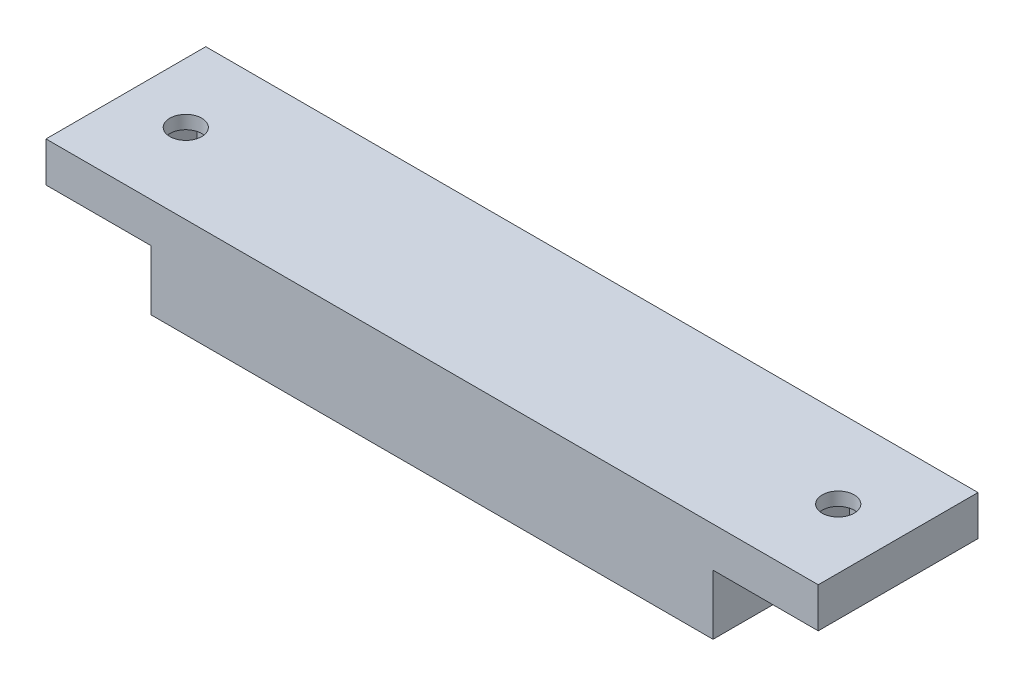
ISO-10303-21;
HEADER;
FILE_DESCRIPTION(('STEP AP214'),'2;1');
FILE_NAME('part.step','',(''),(''),'','','');
FILE_SCHEMA(('AUTOMOTIVE_DESIGN { 1 0 10303 214 1 1 1 1 }'));
ENDSEC;
DATA;
#1=APPLICATION_CONTEXT('core data for automotive mechanical design processes');
#2=APPLICATION_PROTOCOL_DEFINITION('international standard','automotive_design',2000,#1);
#3=PRODUCT_CONTEXT('',#1,'mechanical');
#4=PRODUCT('Part','Part','',(#3));
#5=PRODUCT_RELATED_PRODUCT_CATEGORY('part','',(#4));
#6=PRODUCT_DEFINITION_FORMATION('','',#4);
#7=PRODUCT_DEFINITION_CONTEXT('part definition',#1,'design');
#8=PRODUCT_DEFINITION('design','',#6,#7);
#9=PRODUCT_DEFINITION_SHAPE('','',#8);
#10=(LENGTH_UNIT() NAMED_UNIT(*) SI_UNIT(.MILLI.,.METRE.));
#11=(NAMED_UNIT(*) PLANE_ANGLE_UNIT() SI_UNIT($,.RADIAN.));
#12=(NAMED_UNIT(*) SI_UNIT($,.STERADIAN.) SOLID_ANGLE_UNIT());
#13=UNCERTAINTY_MEASURE_WITH_UNIT(LENGTH_MEASURE(1.E-05),#10,'distance_accuracy_value','');
#14=(GEOMETRIC_REPRESENTATION_CONTEXT(3) GLOBAL_UNCERTAINTY_ASSIGNED_CONTEXT((#13)) GLOBAL_UNIT_ASSIGNED_CONTEXT((#10,
#11,#12)) REPRESENTATION_CONTEXT('',''));
#15=CARTESIAN_POINT('',(0.,0.,0.));
#16=DIRECTION('',(0.,0.,1.));
#17=DIRECTION('',(1.,0.,0.));
#18=AXIS2_PLACEMENT_3D('',#15,#16,#17);
#19=CARTESIAN_POINT('',(21.1,6.,-6.));
#20=DIRECTION('',(-1.,0.,0.));
#21=DIRECTION('',(0.,0.,1.));
#22=AXIS2_PLACEMENT_3D('',#19,#20,#21);
#23=PLANE('',#22);
#24=DIRECTION('',(0.,0.,-1.));
#25=VECTOR('',#24,1.);
#26=CARTESIAN_POINT('',(21.1,4.5,-6.));
#27=LINE('',#26,#25);
#28=CARTESIAN_POINT('',(21.1,4.5,6.));
#29=VERTEX_POINT('',#28);
#30=CARTESIAN_POINT('',(21.1,4.5,-6.));
#31=VERTEX_POINT('',#30);
#32=EDGE_CURVE('E333',#29,#31,#27,.T.);
#33=ORIENTED_EDGE('',*,*,#32,.F.);
#34=DIRECTION('',(0.,-1.,0.));
#35=VECTOR('',#34,1.);
#36=CARTESIAN_POINT('',(21.1,6.,6.));
#37=LINE('',#36,#35);
#38=CARTESIAN_POINT('',(21.1,0.,6.));
#39=VERTEX_POINT('',#38);
#40=EDGE_CURVE('E376',#29,#39,#37,.T.);
#41=ORIENTED_EDGE('',*,*,#40,.T.);
#42=DIRECTION('',(0.,0.,-1.));
#43=VECTOR('',#42,1.);
#44=CARTESIAN_POINT('',(21.1,0.,-6.));
#45=LINE('',#44,#43);
#46=CARTESIAN_POINT('',(21.1,0.,1.24999999999999));
#47=VERTEX_POINT('',#46);
#48=EDGE_CURVE('E363',#39,#47,#45,.T.);
#49=ORIENTED_EDGE('',*,*,#48,.T.);
#50=DIRECTION('',(0.,-0.832050294337844,-0.554700196225229));
#51=VECTOR('',#50,1.);
#52=CARTESIAN_POINT('',(21.1,3.,3.24999999999999));
#53=LINE('',#52,#51);
#54=CARTESIAN_POINT('',(21.1,3.,3.24999999999999));
#55=VERTEX_POINT('',#54);
#56=EDGE_CURVE('E350',#55,#47,#53,.T.);
#57=ORIENTED_EDGE('',*,*,#56,.F.);
#58=DIRECTION('',(0.,0.,1.));
#59=VECTOR('',#58,1.);
#60=CARTESIAN_POINT('',(21.1,3.,3.24999999999999));
#61=LINE('',#60,#59);
#62=CARTESIAN_POINT('',(21.1,2.99999999999999,-3.24999999999998));
#63=VERTEX_POINT('',#62);
#64=EDGE_CURVE('E336',#63,#55,#61,.T.);
#65=ORIENTED_EDGE('',*,*,#64,.F.);
#66=DIRECTION('',(0.,0.832050294337842,-0.554700196225232));
#67=VECTOR('',#66,1.);
#68=CARTESIAN_POINT('',(21.1,2.99999999999999,-3.24999999999998));
#69=LINE('',#68,#67);
#70=CARTESIAN_POINT('',(21.1,0.,-1.24999999999997));
#71=VERTEX_POINT('',#70);
#72=EDGE_CURVE('E341',#71,#63,#69,.T.);
#73=ORIENTED_EDGE('',*,*,#72,.F.);
#74=CARTESIAN_POINT('',(21.1,0.,-6.));
#75=VERTEX_POINT('',#74);
#76=EDGE_CURVE('E356',#71,#75,#45,.T.);
#77=ORIENTED_EDGE('',*,*,#76,.T.);
#78=DIRECTION('',(0.,-1.,0.));
#79=VECTOR('',#78,1.);
#80=CARTESIAN_POINT('',(21.1,6.,-6.));
#81=LINE('',#80,#79);
#82=EDGE_CURVE('E11',#31,#75,#81,.T.);
#83=ORIENTED_EDGE('',*,*,#82,.F.);
#84=EDGE_LOOP('',(#33,#41,#49,#57,#65,#73,#77,#83));
#85=FACE_BOUND('',#84,.T.);
#86=ADVANCED_FACE('F33',(#85),#23,.F.);
#87=CARTESIAN_POINT('',(-21.1,6.,-6.));
#88=DIRECTION('',(1.,0.,0.));
#89=DIRECTION('',(0.,0.,-1.));
#90=AXIS2_PLACEMENT_3D('',#87,#88,#89);
#91=PLANE('',#90);
#92=DIRECTION('',(0.,0.,1.));
#93=VECTOR('',#92,1.);
#94=CARTESIAN_POINT('',(-21.1,4.5,-6.));
#95=LINE('',#94,#93);
#96=CARTESIAN_POINT('',(-21.1,4.5,-6.));
#97=VERTEX_POINT('',#96);
#98=CARTESIAN_POINT('',(-21.1,4.5,6.));
#99=VERTEX_POINT('',#98);
#100=EDGE_CURVE('E325',#97,#99,#95,.T.);
#101=ORIENTED_EDGE('',*,*,#100,.F.);
#102=DIRECTION('',(0.,-1.,0.));
#103=VECTOR('',#102,1.);
#104=CARTESIAN_POINT('',(-21.1,6.,-6.));
#105=LINE('',#104,#103);
#106=CARTESIAN_POINT('',(-21.1,0.,-6.));
#107=VERTEX_POINT('',#106);
#108=EDGE_CURVE('E40',#97,#107,#105,.T.);
#109=ORIENTED_EDGE('',*,*,#108,.T.);
#110=DIRECTION('',(0.,0.,1.));
#111=VECTOR('',#110,1.);
#112=CARTESIAN_POINT('',(-21.1,0.,-6.));
#113=LINE('',#112,#111);
#114=CARTESIAN_POINT('',(-21.1,0.,-1.24999999999999));
#115=VERTEX_POINT('',#114);
#116=EDGE_CURVE('E370',#107,#115,#113,.T.);
#117=ORIENTED_EDGE('',*,*,#116,.T.);
#118=DIRECTION('',(0.,0.832050294337842,-0.554700196225232));
#119=VECTOR('',#118,1.);
#120=CARTESIAN_POINT('',(-21.1,2.99999999999999,-3.25));
#121=LINE('',#120,#119);
#122=CARTESIAN_POINT('',(-21.1,2.99999999999999,-3.25));
#123=VERTEX_POINT('',#122);
#124=EDGE_CURVE('E344',#115,#123,#121,.T.);
#125=ORIENTED_EDGE('',*,*,#124,.T.);
#126=DIRECTION('',(0.,0.,1.));
#127=VECTOR('',#126,1.);
#128=CARTESIAN_POINT('',(-21.1,3.,3.24999999999997));
#129=LINE('',#128,#127);
#130=CARTESIAN_POINT('',(-21.1,3.,3.24999999999997));
#131=VERTEX_POINT('',#130);
#132=EDGE_CURVE('E337',#123,#131,#129,.T.);
#133=ORIENTED_EDGE('',*,*,#132,.T.);
#134=DIRECTION('',(0.,-0.832050294337844,-0.554700196225229));
#135=VECTOR('',#134,1.);
#136=CARTESIAN_POINT('',(-21.1,3.,3.24999999999997));
#137=LINE('',#136,#135);
#138=CARTESIAN_POINT('',(-21.1,0.,1.24999999999997));
#139=VERTEX_POINT('',#138);
#140=EDGE_CURVE('E340',#131,#139,#137,.T.);
#141=ORIENTED_EDGE('',*,*,#140,.T.);
#142=CARTESIAN_POINT('',(-21.1,0.,6.));
#143=VERTEX_POINT('',#142);
#144=EDGE_CURVE('E369',#139,#143,#113,.T.);
#145=ORIENTED_EDGE('',*,*,#144,.T.);
#146=DIRECTION('',(0.,-1.,0.));
#147=VECTOR('',#146,1.);
#148=CARTESIAN_POINT('',(-21.1,6.,6.));
#149=LINE('',#148,#147);
#150=EDGE_CURVE('E378',#99,#143,#149,.T.);
#151=ORIENTED_EDGE('',*,*,#150,.F.);
#152=EDGE_LOOP('',(#101,#109,#117,#125,#133,#141,#145,#151));
#153=FACE_BOUND('',#152,.T.);
#154=ADVANCED_FACE('F381',(#153),#91,.F.);
#155=CARTESIAN_POINT('',(0.,0.,0.));
#156=DIRECTION('',(0.,1.,0.));
#157=DIRECTION('',(0.,0.,1.));
#158=AXIS2_PLACEMENT_3D('',#155,#156,#157);
#159=PLANE('',#158);
#160=ORIENTED_EDGE('',*,*,#76,.F.);
#161=DIRECTION('',(1.,0.,0.));
#162=VECTOR('',#161,1.);
#163=CARTESIAN_POINT('',(-21.1,0.,-1.24999999999999));
#164=LINE('',#163,#162);
#165=EDGE_CURVE('E357',#115,#71,#164,.T.);
#166=ORIENTED_EDGE('',*,*,#165,.F.);
#167=ORIENTED_EDGE('',*,*,#116,.F.);
#168=DIRECTION('',(-1.,0.,0.));
#169=VECTOR('',#168,1.);
#170=CARTESIAN_POINT('',(-21.1,0.,-6.));
#171=LINE('',#170,#169);
#172=EDGE_CURVE('E366',#75,#107,#171,.T.);
#173=ORIENTED_EDGE('',*,*,#172,.F.);
#174=EDGE_LOOP('',(#160,#166,#167,#173));
#175=FACE_BOUND('',#174,.T.);
#176=ADVANCED_FACE('F391',(#175),#159,.F.);
#177=CARTESIAN_POINT('',(-21.1,6.,-6.));
#178=DIRECTION('',(0.,0.,1.));
#179=DIRECTION('',(1.,0.,0.));
#180=AXIS2_PLACEMENT_3D('',#177,#178,#179);
#181=PLANE('',#180);
#182=DIRECTION('',(-1.,0.,0.));
#183=VECTOR('',#182,1.);
#184=CARTESIAN_POINT('',(-29.,4.5,-6.));
#185=LINE('',#184,#183);
#186=CARTESIAN_POINT('',(29.,4.5,-6.));
#187=VERTEX_POINT('',#186);
#188=EDGE_CURVE('E302',#187,#31,#185,.T.);
#189=ORIENTED_EDGE('',*,*,#188,.T.);
#190=ORIENTED_EDGE('',*,*,#82,.T.);
#191=ORIENTED_EDGE('',*,*,#172,.T.);
#192=ORIENTED_EDGE('',*,*,#108,.F.);
#193=CARTESIAN_POINT('',(-29.,4.5,-6.));
#194=VERTEX_POINT('',#193);
#195=EDGE_CURVE('E300',#97,#194,#185,.T.);
#196=ORIENTED_EDGE('',*,*,#195,.T.);
#197=DIRECTION('',(0.,1.,0.));
#198=VECTOR('',#197,1.);
#199=CARTESIAN_POINT('',(-29.,4.5,-6.));
#200=LINE('',#199,#198);
#201=CARTESIAN_POINT('',(-29.,7.5,-6.));
#202=VERTEX_POINT('',#201);
#203=EDGE_CURVE('E328',#194,#202,#200,.T.);
#204=ORIENTED_EDGE('',*,*,#203,.T.);
#205=DIRECTION('',(-1.,0.,0.));
#206=VECTOR('',#205,1.);
#207=CARTESIAN_POINT('',(-29.,7.5,-6.));
#208=LINE('',#207,#206);
#209=CARTESIAN_POINT('',(29.,7.5,-6.));
#210=VERTEX_POINT('',#209);
#211=EDGE_CURVE('E315',#210,#202,#208,.T.);
#212=ORIENTED_EDGE('',*,*,#211,.F.);
#213=DIRECTION('',(0.,1.,0.));
#214=VECTOR('',#213,1.);
#215=CARTESIAN_POINT('',(29.,4.5,-6.));
#216=LINE('',#215,#214);
#217=EDGE_CURVE('E312',#187,#210,#216,.T.);
#218=ORIENTED_EDGE('',*,*,#217,.F.);
#219=EDGE_LOOP('',(#189,#190,#191,#192,#196,#204,#212,#218));
#220=FACE_BOUND('',#219,.T.);
#221=ADVANCED_FACE('F386',(#220),#181,.F.);
#222=CARTESIAN_POINT('',(-21.1,6.,6.));
#223=DIRECTION('',(0.,0.,-1.));
#224=DIRECTION('',(-1.,0.,0.));
#225=AXIS2_PLACEMENT_3D('',#222,#223,#224);
#226=PLANE('',#225);
#227=ORIENTED_EDGE('',*,*,#40,.F.);
#228=DIRECTION('',(1.,0.,0.));
#229=VECTOR('',#228,1.);
#230=CARTESIAN_POINT('',(-29.,4.5,6.));
#231=LINE('',#230,#229);
#232=CARTESIAN_POINT('',(29.,4.5,6.));
#233=VERTEX_POINT('',#232);
#234=EDGE_CURVE('E308',#29,#233,#231,.T.);
#235=ORIENTED_EDGE('',*,*,#234,.T.);
#236=DIRECTION('',(0.,1.,0.));
#237=VECTOR('',#236,1.);
#238=CARTESIAN_POINT('',(29.,4.5,6.));
#239=LINE('',#238,#237);
#240=CARTESIAN_POINT('',(29.,7.5,6.));
#241=VERTEX_POINT('',#240);
#242=EDGE_CURVE('E323',#233,#241,#239,.T.);
#243=ORIENTED_EDGE('',*,*,#242,.T.);
#244=DIRECTION('',(1.,0.,0.));
#245=VECTOR('',#244,1.);
#246=CARTESIAN_POINT('',(-29.,7.5,6.));
#247=LINE('',#246,#245);
#248=CARTESIAN_POINT('',(-29.,7.5,6.));
#249=VERTEX_POINT('',#248);
#250=EDGE_CURVE('E301',#249,#241,#247,.T.);
#251=ORIENTED_EDGE('',*,*,#250,.F.);
#252=DIRECTION('',(0.,1.,0.));
#253=VECTOR('',#252,1.);
#254=CARTESIAN_POINT('',(-29.,4.5,6.));
#255=LINE('',#254,#253);
#256=CARTESIAN_POINT('',(-29.,4.5,6.));
#257=VERTEX_POINT('',#256);
#258=EDGE_CURVE('E326',#257,#249,#255,.T.);
#259=ORIENTED_EDGE('',*,*,#258,.F.);
#260=EDGE_CURVE('E309',#257,#99,#231,.T.);
#261=ORIENTED_EDGE('',*,*,#260,.T.);
#262=ORIENTED_EDGE('',*,*,#150,.T.);
#263=DIRECTION('',(1.,0.,0.));
#264=VECTOR('',#263,1.);
#265=CARTESIAN_POINT('',(-21.1,0.,6.));
#266=LINE('',#265,#264);
#267=EDGE_CURVE('E373',#143,#39,#266,.T.);
#268=ORIENTED_EDGE('',*,*,#267,.T.);
#269=EDGE_LOOP('',(#227,#235,#243,#251,#259,#261,#262,#268));
#270=FACE_BOUND('',#269,.T.);
#271=ADVANCED_FACE('F411',(#270),#226,.F.);
#272=ORIENTED_EDGE('',*,*,#144,.F.);
#273=DIRECTION('',(1.,0.,0.));
#274=VECTOR('',#273,1.);
#275=CARTESIAN_POINT('',(-21.1,0.,1.24999999999997));
#276=LINE('',#275,#274);
#277=EDGE_CURVE('E359',#139,#47,#276,.T.);
#278=ORIENTED_EDGE('',*,*,#277,.T.);
#279=ORIENTED_EDGE('',*,*,#48,.F.);
#280=ORIENTED_EDGE('',*,*,#267,.F.);
#281=EDGE_LOOP('',(#272,#278,#279,#280));
#282=FACE_BOUND('',#281,.T.);
#283=ADVANCED_FACE('F407',(#282),#159,.F.);
#284=CARTESIAN_POINT('',(-21.1,3.,3.24999999999997));
#285=DIRECTION('',(0.,1.,0.));
#286=DIRECTION('',(0.,0.,1.));
#287=AXIS2_PLACEMENT_3D('',#284,#285,#286);
#288=PLANE('',#287);
#289=ORIENTED_EDGE('',*,*,#64,.T.);
#290=DIRECTION('',(1.,0.,0.));
#291=VECTOR('',#290,1.);
#292=CARTESIAN_POINT('',(-21.1,3.,3.24999999999997));
#293=LINE('',#292,#291);
#294=EDGE_CURVE('E347',#131,#55,#293,.T.);
#295=ORIENTED_EDGE('',*,*,#294,.F.);
#296=ORIENTED_EDGE('',*,*,#132,.F.);
#297=DIRECTION('',(1.,0.,0.));
#298=VECTOR('',#297,1.);
#299=CARTESIAN_POINT('',(-21.1,2.99999999999999,-3.25));
#300=LINE('',#299,#298);
#301=EDGE_CURVE('E354',#123,#63,#300,.T.);
#302=ORIENTED_EDGE('',*,*,#301,.T.);
#303=EDGE_LOOP('',(#289,#295,#296,#302));
#304=FACE_BOUND('',#303,.T.);
#305=ADVANCED_FACE('F399',(#304),#288,.F.);
#306=CARTESIAN_POINT('',(-21.1,2.99999999999999,-3.25));
#307=DIRECTION('',(0.,-0.554700196225232,-0.832050294337842));
#308=DIRECTION('',(0.,0.832050294337842,-0.554700196225232));
#309=AXIS2_PLACEMENT_3D('',#306,#307,#308);
#310=PLANE('',#309);
#311=ORIENTED_EDGE('',*,*,#72,.T.);
#312=ORIENTED_EDGE('',*,*,#301,.F.);
#313=ORIENTED_EDGE('',*,*,#124,.F.);
#314=ORIENTED_EDGE('',*,*,#165,.T.);
#315=EDGE_LOOP('',(#311,#312,#313,#314));
#316=FACE_BOUND('',#315,.T.);
#317=ADVANCED_FACE('F394',(#316),#310,.F.);
#318=CARTESIAN_POINT('',(-21.1,3.,3.24999999999997));
#319=DIRECTION('',(0.,-0.554700196225229,0.832050294337844));
#320=DIRECTION('',(0.,-0.832050294337843,-0.554700196225229));
#321=AXIS2_PLACEMENT_3D('',#318,#319,#320);
#322=PLANE('',#321);
#323=ORIENTED_EDGE('',*,*,#56,.T.);
#324=ORIENTED_EDGE('',*,*,#277,.F.);
#325=ORIENTED_EDGE('',*,*,#140,.F.);
#326=ORIENTED_EDGE('',*,*,#294,.T.);
#327=EDGE_LOOP('',(#323,#324,#325,#326));
#328=FACE_BOUND('',#327,.T.);
#329=ADVANCED_FACE('F465',(#328),#322,.F.);
#330=CARTESIAN_POINT('',(0.,4.5,0.));
#331=DIRECTION('',(0.,1.,0.));
#332=DIRECTION('',(0.,0.,1.));
#333=AXIS2_PLACEMENT_3D('',#330,#331,#332);
#334=PLANE('',#333);
#335=DIRECTION('',(1.,0.,0.));
#336=VECTOR('',#335,1.);
#337=CARTESIAN_POINT('',(25.6547005383793,4.5,-2.00000000000001));
#338=LINE('',#337,#336);
#339=CARTESIAN_POINT('',(23.3452994616208,4.5,-2.00000000000001));
#340=VERTEX_POINT('',#339);
#341=CARTESIAN_POINT('',(25.6547005383793,4.5,-2.00000000000001));
#342=VERTEX_POINT('',#341);
#343=EDGE_CURVE('E230',#340,#342,#338,.T.);
#344=ORIENTED_EDGE('',*,*,#343,.F.);
#345=DIRECTION('',(0.499999999999999,0.,-0.866025403784439));
#346=VECTOR('',#345,1.);
#347=CARTESIAN_POINT('',(23.3452994616208,4.5,-2.00000000000001));
#348=LINE('',#347,#346);
#349=CARTESIAN_POINT('',(22.1905989232415,4.5,0.));
#350=VERTEX_POINT('',#349);
#351=EDGE_CURVE('E47',#350,#340,#348,.T.);
#352=ORIENTED_EDGE('',*,*,#351,.F.);
#353=DIRECTION('',(-0.500000000000002,0.,-0.866025403784437));
#354=VECTOR('',#353,1.);
#355=CARTESIAN_POINT('',(22.1905989232415,4.5,0.));
#356=LINE('',#355,#354);
#357=CARTESIAN_POINT('',(23.3452994616208,4.5,1.99999999999999));
#358=VERTEX_POINT('',#357);
#359=EDGE_CURVE('E213',#358,#350,#356,.T.);
#360=ORIENTED_EDGE('',*,*,#359,.F.);
#361=DIRECTION('',(-1.,0.,0.));
#362=VECTOR('',#361,1.);
#363=CARTESIAN_POINT('',(23.3452994616208,4.5,1.99999999999999));
#364=LINE('',#363,#362);
#365=CARTESIAN_POINT('',(25.6547005383793,4.5,1.99999999999999));
#366=VERTEX_POINT('',#365);
#367=EDGE_CURVE('E216',#366,#358,#364,.T.);
#368=ORIENTED_EDGE('',*,*,#367,.F.);
#369=DIRECTION('',(-0.499999999999997,0.,0.86602540378444));
#370=VECTOR('',#369,1.);
#371=CARTESIAN_POINT('',(25.6547005383793,4.5,1.99999999999999));
#372=LINE('',#371,#370);
#373=CARTESIAN_POINT('',(26.8094010767585,4.5,0.));
#374=VERTEX_POINT('',#373);
#375=EDGE_CURVE('E236',#374,#366,#372,.T.);
#376=ORIENTED_EDGE('',*,*,#375,.F.);
#377=DIRECTION('',(0.5,0.,0.866025403784439));
#378=VECTOR('',#377,1.);
#379=CARTESIAN_POINT('',(26.8094010767585,4.5,0.));
#380=LINE('',#379,#378);
#381=EDGE_CURVE('E233',#342,#374,#380,.T.);
#382=ORIENTED_EDGE('',*,*,#381,.F.);
#383=EDGE_LOOP('',(#344,#352,#360,#368,#376,#382));
#384=FACE_BOUND('',#383,.T.);
#385=ORIENTED_EDGE('',*,*,#234,.F.);
#386=ORIENTED_EDGE('',*,*,#32,.T.);
#387=ORIENTED_EDGE('',*,*,#188,.F.);
#388=DIRECTION('',(0.,0.,-1.));
#389=VECTOR('',#388,1.);
#390=CARTESIAN_POINT('',(29.,4.5,-6.));
#391=LINE('',#390,#389);
#392=EDGE_CURVE('E297',#233,#187,#391,.T.);
#393=ORIENTED_EDGE('',*,*,#392,.F.);
#394=EDGE_LOOP('',(#385,#386,#387,#393));
#395=FACE_BOUND('',#394,.T.);
#396=ADVANCED_FACE('F430',(#384,#395),#334,.F.);
#397=DIRECTION('',(-0.5,0.,0.866025403784439));
#398=VECTOR('',#397,1.);
#399=CARTESIAN_POINT('',(-22.1905989232415,4.5,0.));
#400=LINE('',#399,#398);
#401=CARTESIAN_POINT('',(-22.1905989232415,4.5,0.));
#402=VERTEX_POINT('',#401);
#403=CARTESIAN_POINT('',(-23.3452994616208,4.5,2.));
#404=VERTEX_POINT('',#403);
#405=EDGE_CURVE('E271',#402,#404,#400,.T.);
#406=ORIENTED_EDGE('',*,*,#405,.F.);
#407=DIRECTION('',(0.5,0.,0.866025403784439));
#408=VECTOR('',#407,1.);
#409=CARTESIAN_POINT('',(-23.3452994616207,4.5,-2.));
#410=LINE('',#409,#408);
#411=CARTESIAN_POINT('',(-23.3452994616207,4.5,-2.));
#412=VERTEX_POINT('',#411);
#413=EDGE_CURVE('E55',#412,#402,#410,.T.);
#414=ORIENTED_EDGE('',*,*,#413,.F.);
#415=DIRECTION('',(1.,0.,0.));
#416=VECTOR('',#415,1.);
#417=CARTESIAN_POINT('',(-25.6547005383793,4.5,-2.));
#418=LINE('',#417,#416);
#419=CARTESIAN_POINT('',(-25.6547005383793,4.5,-2.));
#420=VERTEX_POINT('',#419);
#421=EDGE_CURVE('E254',#420,#412,#418,.T.);
#422=ORIENTED_EDGE('',*,*,#421,.F.);
#423=DIRECTION('',(0.5,0.,-0.866025403784439));
#424=VECTOR('',#423,1.);
#425=CARTESIAN_POINT('',(-26.8094010767585,4.5,0.));
#426=LINE('',#425,#424);
#427=CARTESIAN_POINT('',(-26.8094010767585,4.5,0.));
#428=VERTEX_POINT('',#427);
#429=EDGE_CURVE('E280',#428,#420,#426,.T.);
#430=ORIENTED_EDGE('',*,*,#429,.F.);
#431=DIRECTION('',(-0.5,0.,-0.866025403784439));
#432=VECTOR('',#431,1.);
#433=CARTESIAN_POINT('',(-25.6547005383793,4.5,2.));
#434=LINE('',#433,#432);
#435=CARTESIAN_POINT('',(-25.6547005383793,4.5,2.));
#436=VERTEX_POINT('',#435);
#437=EDGE_CURVE('E277',#436,#428,#434,.T.);
#438=ORIENTED_EDGE('',*,*,#437,.F.);
#439=DIRECTION('',(-1.,0.,0.));
#440=VECTOR('',#439,1.);
#441=CARTESIAN_POINT('',(-23.3452994616208,4.5,2.));
#442=LINE('',#441,#440);
#443=EDGE_CURVE('E274',#404,#436,#442,.T.);
#444=ORIENTED_EDGE('',*,*,#443,.F.);
#445=EDGE_LOOP('',(#406,#414,#422,#430,#438,#444));
#446=FACE_BOUND('',#445,.T.);
#447=ORIENTED_EDGE('',*,*,#195,.F.);
#448=ORIENTED_EDGE('',*,*,#100,.T.);
#449=ORIENTED_EDGE('',*,*,#260,.F.);
#450=DIRECTION('',(0.,0.,1.));
#451=VECTOR('',#450,1.);
#452=CARTESIAN_POINT('',(-29.,4.5,-6.));
#453=LINE('',#452,#451);
#454=EDGE_CURVE('E305',#194,#257,#453,.T.);
#455=ORIENTED_EDGE('',*,*,#454,.F.);
#456=EDGE_LOOP('',(#447,#448,#449,#455));
#457=FACE_BOUND('',#456,.T.);
#458=ADVANCED_FACE('F415',(#446,#457),#334,.F.);
#459=CARTESIAN_POINT('',(29.,4.5,-6.));
#460=DIRECTION('',(1.,0.,0.));
#461=DIRECTION('',(0.,0.,-1.));
#462=AXIS2_PLACEMENT_3D('',#459,#460,#461);
#463=PLANE('',#462);
#464=DIRECTION('',(0.,0.,-1.));
#465=VECTOR('',#464,1.);
#466=CARTESIAN_POINT('',(29.,7.5,-6.));
#467=LINE('',#466,#465);
#468=EDGE_CURVE('E287',#241,#210,#467,.T.);
#469=ORIENTED_EDGE('',*,*,#468,.F.);
#470=ORIENTED_EDGE('',*,*,#242,.F.);
#471=ORIENTED_EDGE('',*,*,#392,.T.);
#472=ORIENTED_EDGE('',*,*,#217,.T.);
#473=EDGE_LOOP('',(#469,#470,#471,#472));
#474=FACE_BOUND('',#473,.T.);
#475=ADVANCED_FACE('F432',(#474),#463,.T.);
#476=CARTESIAN_POINT('',(-29.,4.5,-6.));
#477=DIRECTION('',(-1.,0.,0.));
#478=DIRECTION('',(0.,0.,1.));
#479=AXIS2_PLACEMENT_3D('',#476,#477,#478);
#480=PLANE('',#479);
#481=DIRECTION('',(0.,0.,1.));
#482=VECTOR('',#481,1.);
#483=CARTESIAN_POINT('',(-29.,7.5,-6.));
#484=LINE('',#483,#482);
#485=EDGE_CURVE('E318',#202,#249,#484,.T.);
#486=ORIENTED_EDGE('',*,*,#485,.F.);
#487=ORIENTED_EDGE('',*,*,#203,.F.);
#488=ORIENTED_EDGE('',*,*,#454,.T.);
#489=ORIENTED_EDGE('',*,*,#258,.T.);
#490=EDGE_LOOP('',(#486,#487,#488,#489));
#491=FACE_BOUND('',#490,.T.);
#492=ADVANCED_FACE('F421',(#491),#480,.T.);
#493=CARTESIAN_POINT('',(0.,7.5,0.));
#494=DIRECTION('',(0.,1.,0.));
#495=DIRECTION('',(0.,0.,1.));
#496=AXIS2_PLACEMENT_3D('',#493,#494,#495);
#497=PLANE('',#496);
#498=CARTESIAN_POINT('',(24.5,7.5,0.));
#499=DIRECTION('',(0.,1.,0.));
#500=DIRECTION('',(0.,0.,1.));
#501=AXIS2_PLACEMENT_3D('',#498,#499,#500);
#502=CIRCLE('',#501,1.2);
#503=CARTESIAN_POINT('',(24.5,7.5,1.2));
#504=VERTEX_POINT('',#503);
#505=EDGE_CURVE('E659',#504,#504,#502,.F.);
#506=ORIENTED_EDGE('',*,*,#505,.T.);
#507=EDGE_LOOP('',(#506));
#508=FACE_BOUND('',#507,.T.);
#509=CARTESIAN_POINT('',(-24.5,7.5,0.));
#510=DIRECTION('',(0.,1.,0.));
#511=DIRECTION('',(0.,0.,1.));
#512=AXIS2_PLACEMENT_3D('',#509,#510,#511);
#513=CIRCLE('',#512,1.2);
#514=CARTESIAN_POINT('',(-24.5,7.5,1.2));
#515=VERTEX_POINT('',#514);
#516=EDGE_CURVE('E219',#515,#515,#513,.F.);
#517=ORIENTED_EDGE('',*,*,#516,.T.);
#518=EDGE_LOOP('',(#517));
#519=FACE_BOUND('',#518,.T.);
#520=ORIENTED_EDGE('',*,*,#468,.T.);
#521=ORIENTED_EDGE('',*,*,#211,.T.);
#522=ORIENTED_EDGE('',*,*,#485,.T.);
#523=ORIENTED_EDGE('',*,*,#250,.T.);
#524=EDGE_LOOP('',(#520,#521,#522,#523));
#525=FACE_BOUND('',#524,.T.);
#526=ADVANCED_FACE('F424',(#508,#519,#525),#497,.T.);
#527=CARTESIAN_POINT('',(-23.3452994616207,6.5,-2.));
#528=DIRECTION('',(0.866025403784439,0.,-0.5));
#529=DIRECTION('',(-0.5,0.,-0.866025403784439));
#530=AXIS2_PLACEMENT_3D('',#527,#528,#529);
#531=PLANE('',#530);
#532=ORIENTED_EDGE('',*,*,#413,.T.);
#533=DIRECTION('',(0.,-1.,0.));
#534=VECTOR('',#533,1.);
#535=CARTESIAN_POINT('',(-22.1905989232415,6.5,0.));
#536=LINE('',#535,#534);
#537=CARTESIAN_POINT('',(-22.1905989232415,6.5,0.));
#538=VERTEX_POINT('',#537);
#539=EDGE_CURVE('E269',#538,#402,#536,.T.);
#540=ORIENTED_EDGE('',*,*,#539,.F.);
#541=DIRECTION('',(0.5,0.,0.866025403784439));
#542=VECTOR('',#541,1.);
#543=CARTESIAN_POINT('',(-23.3452994616207,6.5,-2.));
#544=LINE('',#543,#542);
#545=CARTESIAN_POINT('',(-23.3452994616207,6.5,-2.));
#546=VERTEX_POINT('',#545);
#547=EDGE_CURVE('E250',#546,#538,#544,.T.);
#548=ORIENTED_EDGE('',*,*,#547,.F.);
#549=DIRECTION('',(0.,-1.,0.));
#550=VECTOR('',#549,1.);
#551=CARTESIAN_POINT('',(-23.3452994616207,6.5,-2.));
#552=LINE('',#551,#550);
#553=EDGE_CURVE('E285',#546,#412,#552,.T.);
#554=ORIENTED_EDGE('',*,*,#553,.T.);
#555=EDGE_LOOP('',(#532,#540,#548,#554));
#556=FACE_BOUND('',#555,.T.);
#557=ADVANCED_FACE('F493',(#556),#531,.F.);
#558=CARTESIAN_POINT('',(-25.6547005383793,6.5,-2.));
#559=DIRECTION('',(0.,0.,-1.));
#560=DIRECTION('',(-1.,0.,0.));
#561=AXIS2_PLACEMENT_3D('',#558,#559,#560);
#562=PLANE('',#561);
#563=ORIENTED_EDGE('',*,*,#421,.T.);
#564=ORIENTED_EDGE('',*,*,#553,.F.);
#565=DIRECTION('',(1.,0.,0.));
#566=VECTOR('',#565,1.);
#567=CARTESIAN_POINT('',(-25.6547005383793,6.5,-2.));
#568=LINE('',#567,#566);
#569=CARTESIAN_POINT('',(-25.6547005383793,6.5,-2.));
#570=VERTEX_POINT('',#569);
#571=EDGE_CURVE('E266',#570,#546,#568,.T.);
#572=ORIENTED_EDGE('',*,*,#571,.F.);
#573=DIRECTION('',(0.,-1.,0.));
#574=VECTOR('',#573,1.);
#575=CARTESIAN_POINT('',(-25.6547005383793,6.5,-2.));
#576=LINE('',#575,#574);
#577=EDGE_CURVE('E288',#570,#420,#576,.T.);
#578=ORIENTED_EDGE('',*,*,#577,.T.);
#579=EDGE_LOOP('',(#563,#564,#572,#578));
#580=FACE_BOUND('',#579,.T.);
#581=ADVANCED_FACE('F498',(#580),#562,.F.);
#582=CARTESIAN_POINT('',(-26.8094010767585,6.5,0.));
#583=DIRECTION('',(-0.866025403784439,0.,-0.5));
#584=DIRECTION('',(-0.5,0.,0.866025403784439));
#585=AXIS2_PLACEMENT_3D('',#582,#583,#584);
#586=PLANE('',#585);
#587=ORIENTED_EDGE('',*,*,#429,.T.);
#588=ORIENTED_EDGE('',*,*,#577,.F.);
#589=DIRECTION('',(0.5,0.,-0.866025403784439));
#590=VECTOR('',#589,1.);
#591=CARTESIAN_POINT('',(-26.8094010767585,6.5,0.));
#592=LINE('',#591,#590);
#593=CARTESIAN_POINT('',(-26.8094010767585,6.5,0.));
#594=VERTEX_POINT('',#593);
#595=EDGE_CURVE('E263',#594,#570,#592,.T.);
#596=ORIENTED_EDGE('',*,*,#595,.F.);
#597=DIRECTION('',(0.,-1.,0.));
#598=VECTOR('',#597,1.);
#599=CARTESIAN_POINT('',(-26.8094010767585,6.5,0.));
#600=LINE('',#599,#598);
#601=EDGE_CURVE('E290',#594,#428,#600,.T.);
#602=ORIENTED_EDGE('',*,*,#601,.T.);
#603=EDGE_LOOP('',(#587,#588,#596,#602));
#604=FACE_BOUND('',#603,.T.);
#605=ADVANCED_FACE('F509',(#604),#586,.F.);
#606=CARTESIAN_POINT('',(-25.6547005383793,6.5,2.));
#607=DIRECTION('',(-0.866025403784439,0.,0.5));
#608=DIRECTION('',(0.5,0.,0.866025403784439));
#609=AXIS2_PLACEMENT_3D('',#606,#607,#608);
#610=PLANE('',#609);
#611=ORIENTED_EDGE('',*,*,#437,.T.);
#612=ORIENTED_EDGE('',*,*,#601,.F.);
#613=DIRECTION('',(-0.5,0.,-0.866025403784439));
#614=VECTOR('',#613,1.);
#615=CARTESIAN_POINT('',(-25.6547005383793,6.5,2.));
#616=LINE('',#615,#614);
#617=CARTESIAN_POINT('',(-25.6547005383793,6.5,2.));
#618=VERTEX_POINT('',#617);
#619=EDGE_CURVE('E260',#618,#594,#616,.T.);
#620=ORIENTED_EDGE('',*,*,#619,.F.);
#621=DIRECTION('',(0.,-1.,0.));
#622=VECTOR('',#621,1.);
#623=CARTESIAN_POINT('',(-25.6547005383793,6.5,2.));
#624=LINE('',#623,#622);
#625=EDGE_CURVE('E292',#618,#436,#624,.T.);
#626=ORIENTED_EDGE('',*,*,#625,.T.);
#627=EDGE_LOOP('',(#611,#612,#620,#626));
#628=FACE_BOUND('',#627,.T.);
#629=ADVANCED_FACE('F519',(#628),#610,.F.);
#630=CARTESIAN_POINT('',(-23.3452994616208,6.5,2.));
#631=DIRECTION('',(0.,0.,1.));
#632=DIRECTION('',(1.,0.,0.));
#633=AXIS2_PLACEMENT_3D('',#630,#631,#632);
#634=PLANE('',#633);
#635=ORIENTED_EDGE('',*,*,#443,.T.);
#636=ORIENTED_EDGE('',*,*,#625,.F.);
#637=DIRECTION('',(-1.,0.,0.));
#638=VECTOR('',#637,1.);
#639=CARTESIAN_POINT('',(-23.3452994616208,6.5,2.));
#640=LINE('',#639,#638);
#641=CARTESIAN_POINT('',(-23.3452994616208,6.5,2.));
#642=VERTEX_POINT('',#641);
#643=EDGE_CURVE('E257',#642,#618,#640,.T.);
#644=ORIENTED_EDGE('',*,*,#643,.F.);
#645=DIRECTION('',(0.,-1.,0.));
#646=VECTOR('',#645,1.);
#647=CARTESIAN_POINT('',(-23.3452994616208,6.5,2.));
#648=LINE('',#647,#646);
#649=EDGE_CURVE('E294',#642,#404,#648,.T.);
#650=ORIENTED_EDGE('',*,*,#649,.T.);
#651=EDGE_LOOP('',(#635,#636,#644,#650));
#652=FACE_BOUND('',#651,.T.);
#653=ADVANCED_FACE('F529',(#652),#634,.F.);
#654=CARTESIAN_POINT('',(-22.1905989232415,6.5,0.));
#655=DIRECTION('',(0.866025403784439,0.,0.5));
#656=DIRECTION('',(0.5,0.,-0.866025403784439));
#657=AXIS2_PLACEMENT_3D('',#654,#655,#656);
#658=PLANE('',#657);
#659=ORIENTED_EDGE('',*,*,#405,.T.);
#660=ORIENTED_EDGE('',*,*,#649,.F.);
#661=DIRECTION('',(-0.5,0.,0.866025403784439));
#662=VECTOR('',#661,1.);
#663=CARTESIAN_POINT('',(-22.1905989232415,6.5,0.));
#664=LINE('',#663,#662);
#665=EDGE_CURVE('E253',#538,#642,#664,.T.);
#666=ORIENTED_EDGE('',*,*,#665,.F.);
#667=ORIENTED_EDGE('',*,*,#539,.T.);
#668=EDGE_LOOP('',(#659,#660,#666,#667));
#669=FACE_BOUND('',#668,.T.);
#670=ADVANCED_FACE('F539',(#669),#658,.F.);
#671=CARTESIAN_POINT('',(0.,6.5,0.));
#672=DIRECTION('',(0.,-1.,0.));
#673=DIRECTION('',(0.,0.,-1.));
#674=AXIS2_PLACEMENT_3D('',#671,#672,#673);
#675=PLANE('',#674);
#676=CARTESIAN_POINT('',(-24.5,6.5,0.));
#677=DIRECTION('',(0.,-1.,0.));
#678=DIRECTION('',(0.,0.,-1.));
#679=AXIS2_PLACEMENT_3D('',#676,#677,#678);
#680=CIRCLE('',#679,1.2);
#681=CARTESIAN_POINT('',(-24.5,6.5,-1.2));
#682=VERTEX_POINT('',#681);
#683=EDGE_CURVE('E231',#682,#682,#680,.T.);
#684=ORIENTED_EDGE('',*,*,#683,.F.);
#685=EDGE_LOOP('',(#684));
#686=FACE_BOUND('',#685,.T.);
#687=ORIENTED_EDGE('',*,*,#547,.T.);
#688=ORIENTED_EDGE('',*,*,#665,.T.);
#689=ORIENTED_EDGE('',*,*,#643,.T.);
#690=ORIENTED_EDGE('',*,*,#619,.T.);
#691=ORIENTED_EDGE('',*,*,#595,.T.);
#692=ORIENTED_EDGE('',*,*,#571,.T.);
#693=EDGE_LOOP('',(#687,#688,#689,#690,#691,#692));
#694=FACE_BOUND('',#693,.T.);
#695=ADVANCED_FACE('F549',(#686,#694),#675,.T.);
#696=CARTESIAN_POINT('',(23.3452994616208,6.5,-2.00000000000001));
#697=DIRECTION('',(-0.866025403784439,0.,-0.499999999999999));
#698=DIRECTION('',(-0.499999999999999,0.,0.866025403784439));
#699=AXIS2_PLACEMENT_3D('',#696,#697,#698);
#700=PLANE('',#699);
#701=ORIENTED_EDGE('',*,*,#351,.T.);
#702=DIRECTION('',(0.,-1.,0.));
#703=VECTOR('',#702,1.);
#704=CARTESIAN_POINT('',(23.3452994616208,6.5,-2.00000000000001));
#705=LINE('',#704,#703);
#706=CARTESIAN_POINT('',(23.3452994616208,6.5,-2.00000000000001));
#707=VERTEX_POINT('',#706);
#708=EDGE_CURVE('E190',#707,#340,#705,.T.);
#709=ORIENTED_EDGE('',*,*,#708,.F.);
#710=DIRECTION('',(0.499999999999999,0.,-0.866025403784439));
#711=VECTOR('',#710,1.);
#712=CARTESIAN_POINT('',(23.3452994616208,6.5,-2.00000000000001));
#713=LINE('',#712,#711);
#714=CARTESIAN_POINT('',(22.1905989232415,6.5,0.));
#715=VERTEX_POINT('',#714);
#716=EDGE_CURVE('E194',#715,#707,#713,.T.);
#717=ORIENTED_EDGE('',*,*,#716,.F.);
#718=DIRECTION('',(0.,-1.,0.));
#719=VECTOR('',#718,1.);
#720=CARTESIAN_POINT('',(22.1905989232415,6.5,0.));
#721=LINE('',#720,#719);
#722=EDGE_CURVE('E241',#715,#350,#721,.T.);
#723=ORIENTED_EDGE('',*,*,#722,.T.);
#724=EDGE_LOOP('',(#701,#709,#717,#723));
#725=FACE_BOUND('',#724,.T.);
#726=ADVANCED_FACE('F192',(#725),#700,.F.);
#727=CARTESIAN_POINT('',(22.1905989232415,6.5,0.));
#728=DIRECTION('',(-0.866025403784437,0.,0.500000000000002));
#729=DIRECTION('',(0.500000000000002,0.,0.866025403784437));
#730=AXIS2_PLACEMENT_3D('',#727,#728,#729);
#731=PLANE('',#730);
#732=ORIENTED_EDGE('',*,*,#359,.T.);
#733=ORIENTED_EDGE('',*,*,#722,.F.);
#734=DIRECTION('',(-0.500000000000002,0.,-0.866025403784437));
#735=VECTOR('',#734,1.);
#736=CARTESIAN_POINT('',(22.1905989232415,6.5,0.));
#737=LINE('',#736,#735);
#738=CARTESIAN_POINT('',(23.3452994616208,6.5,1.99999999999999));
#739=VERTEX_POINT('',#738);
#740=EDGE_CURVE('E200',#739,#715,#737,.T.);
#741=ORIENTED_EDGE('',*,*,#740,.F.);
#742=DIRECTION('',(0.,-1.,0.));
#743=VECTOR('',#742,1.);
#744=CARTESIAN_POINT('',(23.3452994616208,6.5,1.99999999999999));
#745=LINE('',#744,#743);
#746=EDGE_CURVE('E243',#739,#358,#745,.T.);
#747=ORIENTED_EDGE('',*,*,#746,.T.);
#748=EDGE_LOOP('',(#732,#733,#741,#747));
#749=FACE_BOUND('',#748,.T.);
#750=ADVANCED_FACE('F561',(#749),#731,.F.);
#751=CARTESIAN_POINT('',(23.3452994616208,6.5,1.99999999999999));
#752=DIRECTION('',(0.,0.,1.));
#753=DIRECTION('',(1.,0.,0.));
#754=AXIS2_PLACEMENT_3D('',#751,#752,#753);
#755=PLANE('',#754);
#756=ORIENTED_EDGE('',*,*,#367,.T.);
#757=ORIENTED_EDGE('',*,*,#746,.F.);
#758=DIRECTION('',(-1.,0.,0.));
#759=VECTOR('',#758,1.);
#760=CARTESIAN_POINT('',(23.3452994616208,6.5,1.99999999999999));
#761=LINE('',#760,#759);
#762=CARTESIAN_POINT('',(25.6547005383793,6.5,1.99999999999999));
#763=VERTEX_POINT('',#762);
#764=EDGE_CURVE('E226',#763,#739,#761,.T.);
#765=ORIENTED_EDGE('',*,*,#764,.F.);
#766=DIRECTION('',(0.,-1.,0.));
#767=VECTOR('',#766,1.);
#768=CARTESIAN_POINT('',(25.6547005383793,6.5,1.99999999999999));
#769=LINE('',#768,#767);
#770=EDGE_CURVE('E245',#763,#366,#769,.T.);
#771=ORIENTED_EDGE('',*,*,#770,.T.);
#772=EDGE_LOOP('',(#756,#757,#765,#771));
#773=FACE_BOUND('',#772,.T.);
#774=ADVANCED_FACE('F570',(#773),#755,.F.);
#775=CARTESIAN_POINT('',(25.6547005383793,6.5,1.99999999999999));
#776=DIRECTION('',(0.86602540378444,0.,0.499999999999997));
#777=DIRECTION('',(0.499999999999997,0.,-0.86602540378444));
#778=AXIS2_PLACEMENT_3D('',#775,#776,#777);
#779=PLANE('',#778);
#780=ORIENTED_EDGE('',*,*,#375,.T.);
#781=ORIENTED_EDGE('',*,*,#770,.F.);
#782=DIRECTION('',(-0.499999999999997,0.,0.86602540378444));
#783=VECTOR('',#782,1.);
#784=CARTESIAN_POINT('',(25.6547005383793,6.5,1.99999999999999));
#785=LINE('',#784,#783);
#786=CARTESIAN_POINT('',(26.8094010767585,6.5,0.));
#787=VERTEX_POINT('',#786);
#788=EDGE_CURVE('E223',#787,#763,#785,.T.);
#789=ORIENTED_EDGE('',*,*,#788,.F.);
#790=DIRECTION('',(0.,-1.,0.));
#791=VECTOR('',#790,1.);
#792=CARTESIAN_POINT('',(26.8094010767585,6.5,0.));
#793=LINE('',#792,#791);
#794=EDGE_CURVE('E247',#787,#374,#793,.T.);
#795=ORIENTED_EDGE('',*,*,#794,.T.);
#796=EDGE_LOOP('',(#780,#781,#789,#795));
#797=FACE_BOUND('',#796,.T.);
#798=ADVANCED_FACE('F580',(#797),#779,.F.);
#799=CARTESIAN_POINT('',(26.8094010767585,6.5,0.));
#800=DIRECTION('',(0.866025403784439,0.,-0.5));
#801=DIRECTION('',(-0.5,0.,-0.866025403784439));
#802=AXIS2_PLACEMENT_3D('',#799,#800,#801);
#803=PLANE('',#802);
#804=ORIENTED_EDGE('',*,*,#381,.T.);
#805=ORIENTED_EDGE('',*,*,#794,.F.);
#806=DIRECTION('',(0.5,0.,0.866025403784439));
#807=VECTOR('',#806,1.);
#808=CARTESIAN_POINT('',(26.8094010767585,6.5,0.));
#809=LINE('',#808,#807);
#810=CARTESIAN_POINT('',(25.6547005383793,6.5,-2.00000000000001));
#811=VERTEX_POINT('',#810);
#812=EDGE_CURVE('E208',#811,#787,#809,.T.);
#813=ORIENTED_EDGE('',*,*,#812,.F.);
#814=DIRECTION('',(0.,-1.,0.));
#815=VECTOR('',#814,1.);
#816=CARTESIAN_POINT('',(25.6547005383793,6.5,-2.00000000000001));
#817=LINE('',#816,#815);
#818=EDGE_CURVE('E199',#811,#342,#817,.T.);
#819=ORIENTED_EDGE('',*,*,#818,.T.);
#820=EDGE_LOOP('',(#804,#805,#813,#819));
#821=FACE_BOUND('',#820,.T.);
#822=ADVANCED_FACE('F590',(#821),#803,.F.);
#823=CARTESIAN_POINT('',(25.6547005383793,6.5,-2.00000000000001));
#824=DIRECTION('',(0.,0.,-1.));
#825=DIRECTION('',(-1.,0.,0.));
#826=AXIS2_PLACEMENT_3D('',#823,#824,#825);
#827=PLANE('',#826);
#828=ORIENTED_EDGE('',*,*,#343,.T.);
#829=ORIENTED_EDGE('',*,*,#818,.F.);
#830=DIRECTION('',(1.,0.,0.));
#831=VECTOR('',#830,1.);
#832=CARTESIAN_POINT('',(25.6547005383793,6.5,-2.00000000000001));
#833=LINE('',#832,#831);
#834=EDGE_CURVE('E203',#707,#811,#833,.T.);
#835=ORIENTED_EDGE('',*,*,#834,.F.);
#836=ORIENTED_EDGE('',*,*,#708,.T.);
#837=EDGE_LOOP('',(#828,#829,#835,#836));
#838=FACE_BOUND('',#837,.T.);
#839=ADVANCED_FACE('F204',(#838),#827,.F.);
#840=CARTESIAN_POINT('',(0.,6.5,0.));
#841=DIRECTION('',(0.,1.,0.));
#842=DIRECTION('',(0.,0.,1.));
#843=AXIS2_PLACEMENT_3D('',#840,#841,#842);
#844=PLANE('',#843);
#845=CARTESIAN_POINT('',(24.5,6.5,0.));
#846=DIRECTION('',(0.,-1.,0.));
#847=DIRECTION('',(0.,0.,-1.));
#848=AXIS2_PLACEMENT_3D('',#845,#846,#847);
#849=CIRCLE('',#848,1.2);
#850=CARTESIAN_POINT('',(24.5,6.5,-1.2));
#851=VERTEX_POINT('',#850);
#852=EDGE_CURVE('E662',#851,#851,#849,.T.);
#853=ORIENTED_EDGE('',*,*,#852,.F.);
#854=EDGE_LOOP('',(#853));
#855=FACE_BOUND('',#854,.T.);
#856=ORIENTED_EDGE('',*,*,#716,.T.);
#857=ORIENTED_EDGE('',*,*,#834,.T.);
#858=ORIENTED_EDGE('',*,*,#812,.T.);
#859=ORIENTED_EDGE('',*,*,#788,.T.);
#860=ORIENTED_EDGE('',*,*,#764,.T.);
#861=ORIENTED_EDGE('',*,*,#740,.T.);
#862=EDGE_LOOP('',(#856,#857,#858,#859,#860,#861));
#863=FACE_BOUND('',#862,.T.);
#864=ADVANCED_FACE('F210',(#855,#863),#844,.F.);
#865=CARTESIAN_POINT('',(-24.5,7.501,0.));
#866=DIRECTION('',(0.,-1.,0.));
#867=DIRECTION('',(0.,0.,-1.));
#868=AXIS2_PLACEMENT_3D('',#865,#866,#867);
#869=CYLINDRICAL_SURFACE('',#868,1.2);
#870=ORIENTED_EDGE('',*,*,#516,.F.);
#871=EDGE_LOOP('',(#870));
#872=FACE_BOUND('',#871,.T.);
#873=ORIENTED_EDGE('',*,*,#683,.T.);
#874=EDGE_LOOP('',(#873));
#875=FACE_BOUND('',#874,.T.);
#876=ADVANCED_FACE('F632',(#872,#875),#869,.F.);
#877=CARTESIAN_POINT('',(24.5,7.501,0.));
#878=DIRECTION('',(0.,-1.,0.));
#879=DIRECTION('',(0.,0.,-1.));
#880=AXIS2_PLACEMENT_3D('',#877,#878,#879);
#881=CYLINDRICAL_SURFACE('',#880,1.2);
#882=ORIENTED_EDGE('',*,*,#505,.F.);
#883=EDGE_LOOP('',(#882));
#884=FACE_BOUND('',#883,.T.);
#885=ORIENTED_EDGE('',*,*,#852,.T.);
#886=EDGE_LOOP('',(#885));
#887=FACE_BOUND('',#886,.T.);
#888=ADVANCED_FACE('F642',(#884,#887),#881,.F.);
#889=CLOSED_SHELL('',(#86,#154,#176,#221,#271,#283,#305,#317,#329,#396,#458,#475,#492,#526,#557,
#581,#605,#629,#653,#670,#695,#726,#750,#774,#798,#822,#839,#864,#876,#888));
#890=MANIFOLD_SOLID_BREP('B2',#889);
#891=ADVANCED_BREP_SHAPE_REPRESENTATION('',(#18,#890),#14);
#892=SHAPE_DEFINITION_REPRESENTATION(#9,#891);
ENDSEC;
END-ISO-10303-21;
